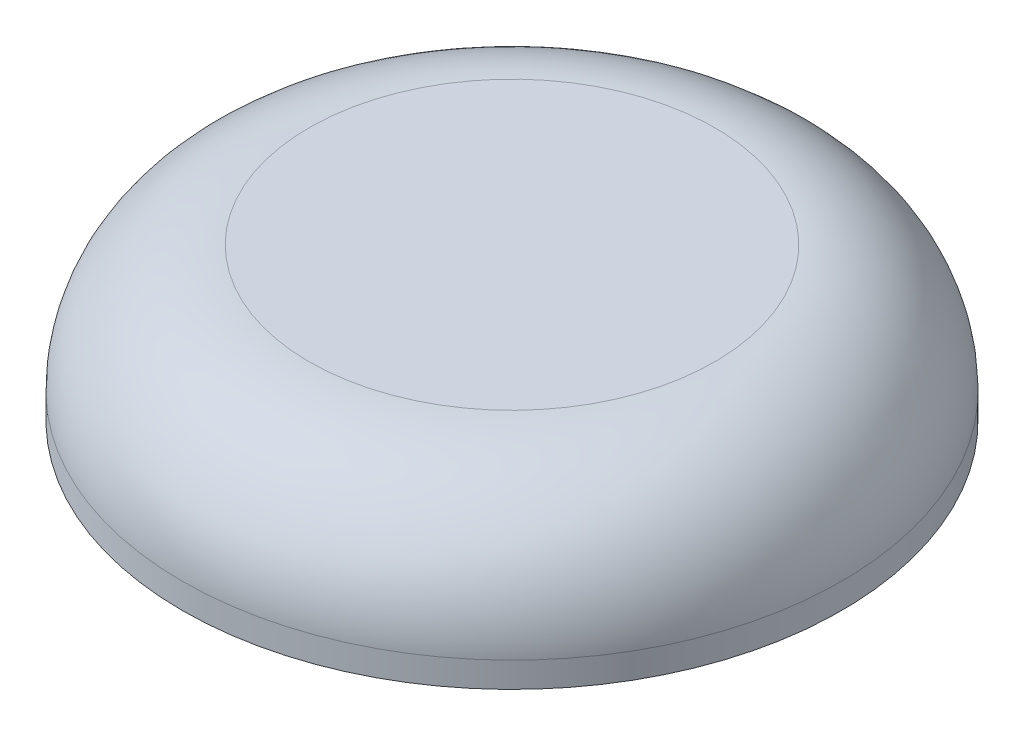
ISO-10303-21;
HEADER;
FILE_DESCRIPTION(('STEP AP214'),'2;1');
FILE_NAME('part.step','',(''),(''),'','','');
FILE_SCHEMA(('AUTOMOTIVE_DESIGN { 1 0 10303 214 1 1 1 1 }'));
ENDSEC;
DATA;
#1=APPLICATION_CONTEXT('core data for automotive mechanical design processes');
#2=APPLICATION_PROTOCOL_DEFINITION('international standard','automotive_design',2000,#1);
#3=PRODUCT_CONTEXT('',#1,'mechanical');
#4=PRODUCT('Part','Part','',(#3));
#5=PRODUCT_RELATED_PRODUCT_CATEGORY('part','',(#4));
#6=PRODUCT_DEFINITION_FORMATION('','',#4);
#7=PRODUCT_DEFINITION_CONTEXT('part definition',#1,'design');
#8=PRODUCT_DEFINITION('design','',#6,#7);
#9=PRODUCT_DEFINITION_SHAPE('','',#8);
#10=(LENGTH_UNIT() NAMED_UNIT(*) SI_UNIT(.MILLI.,.METRE.));
#11=(NAMED_UNIT(*) PLANE_ANGLE_UNIT() SI_UNIT($,.RADIAN.));
#12=(NAMED_UNIT(*) SI_UNIT($,.STERADIAN.) SOLID_ANGLE_UNIT());
#13=UNCERTAINTY_MEASURE_WITH_UNIT(LENGTH_MEASURE(1.E-05),#10,'distance_accuracy_value','');
#14=(GEOMETRIC_REPRESENTATION_CONTEXT(3) GLOBAL_UNCERTAINTY_ASSIGNED_CONTEXT((#13)) GLOBAL_UNIT_ASSIGNED_CONTEXT((#10,
#11,#12)) REPRESENTATION_CONTEXT('',''));
#15=CARTESIAN_POINT('',(0.,0.,0.));
#16=DIRECTION('',(0.,0.,1.));
#17=DIRECTION('',(1.,0.,0.));
#18=AXIS2_PLACEMENT_3D('',#15,#16,#17);
#19=CARTESIAN_POINT('',(0.,3.,0.));
#20=DIRECTION('',(0.,-1.,0.));
#21=DIRECTION('',(0.,0.,-1.));
#22=AXIS2_PLACEMENT_3D('',#19,#20,#21);
#23=CYLINDRICAL_SURFACE('',#22,6.5);
#24=CARTESIAN_POINT('',(0.,0.5,0.));
#25=DIRECTION('',(0.,1.,0.));
#26=DIRECTION('',(0.,0.,1.));
#27=AXIS2_PLACEMENT_3D('',#24,#25,#26);
#28=CIRCLE('',#27,6.5);
#29=CARTESIAN_POINT('',(0.,0.5,6.5));
#30=VERTEX_POINT('',#29);
#31=EDGE_CURVE('E10',#30,#30,#28,.F.);
#32=ORIENTED_EDGE('',*,*,#31,.T.);
#33=EDGE_LOOP('',(#32));
#34=FACE_BOUND('',#33,.T.);
#35=CARTESIAN_POINT('',(0.,0.,0.));
#36=DIRECTION('',(0.,1.,0.));
#37=DIRECTION('',(0.,0.,1.));
#38=AXIS2_PLACEMENT_3D('',#35,#36,#37);
#39=CIRCLE('',#38,6.5);
#40=CARTESIAN_POINT('',(0.,0.,6.5));
#41=VERTEX_POINT('',#40);
#42=EDGE_CURVE('E48',#41,#41,#39,.T.);
#43=ORIENTED_EDGE('',*,*,#42,.T.);
#44=EDGE_LOOP('',(#43));
#45=FACE_BOUND('',#44,.T.);
#46=ADVANCED_FACE('F37',(#34,#45),#23,.T.);
#47=CARTESIAN_POINT('',(0.,3.,0.));
#48=DIRECTION('',(0.,1.,0.));
#49=DIRECTION('',(0.,0.,1.));
#50=AXIS2_PLACEMENT_3D('',#47,#48,#49);
#51=PLANE('',#50);
#52=CARTESIAN_POINT('',(0.,3.,0.));
#53=DIRECTION('',(0.,1.,0.));
#54=DIRECTION('',(0.,0.,1.));
#55=AXIS2_PLACEMENT_3D('',#52,#53,#54);
#56=CIRCLE('',#55,4.);
#57=CARTESIAN_POINT('',(0.,3.,4.));
#58=VERTEX_POINT('',#57);
#59=EDGE_CURVE('E44',#58,#58,#56,.T.);
#60=ORIENTED_EDGE('',*,*,#59,.T.);
#61=EDGE_LOOP('',(#60));
#62=FACE_BOUND('',#61,.T.);
#63=ADVANCED_FACE('F58',(#62),#51,.T.);
#64=CARTESIAN_POINT('',(0.,0.,0.));
#65=DIRECTION('',(0.,1.,0.));
#66=DIRECTION('',(0.,0.,1.));
#67=AXIS2_PLACEMENT_3D('',#64,#65,#66);
#68=PLANE('',#67);
#69=ORIENTED_EDGE('',*,*,#42,.F.);
#70=EDGE_LOOP('',(#69));
#71=FACE_BOUND('',#70,.T.);
#72=ADVANCED_FACE('F56',(#71),#68,.F.);
#73=CARTESIAN_POINT('',(0.,0.5,0.));
#74=DIRECTION('',(0.,1.,0.));
#75=DIRECTION('',(0.,0.,1.));
#76=AXIS2_PLACEMENT_3D('',#73,#74,#75);
#77=TOROIDAL_SURFACE('',#76,4.,2.5);
#78=ORIENTED_EDGE('',*,*,#31,.F.);
#79=EDGE_LOOP('',(#78));
#80=FACE_BOUND('',#79,.T.);
#81=ORIENTED_EDGE('',*,*,#59,.F.);
#82=EDGE_LOOP('',(#81));
#83=FACE_BOUND('',#82,.T.);
#84=ADVANCED_FACE('F39',(#80,#83),#77,.T.);
#85=CLOSED_SHELL('',(#46,#63,#72,#84));
#86=MANIFOLD_SOLID_BREP('B2',#85);
#87=ADVANCED_BREP_SHAPE_REPRESENTATION('',(#18,#86),#14);
#88=SHAPE_DEFINITION_REPRESENTATION(#9,#87);
ENDSEC;
END-ISO-10303-21;
